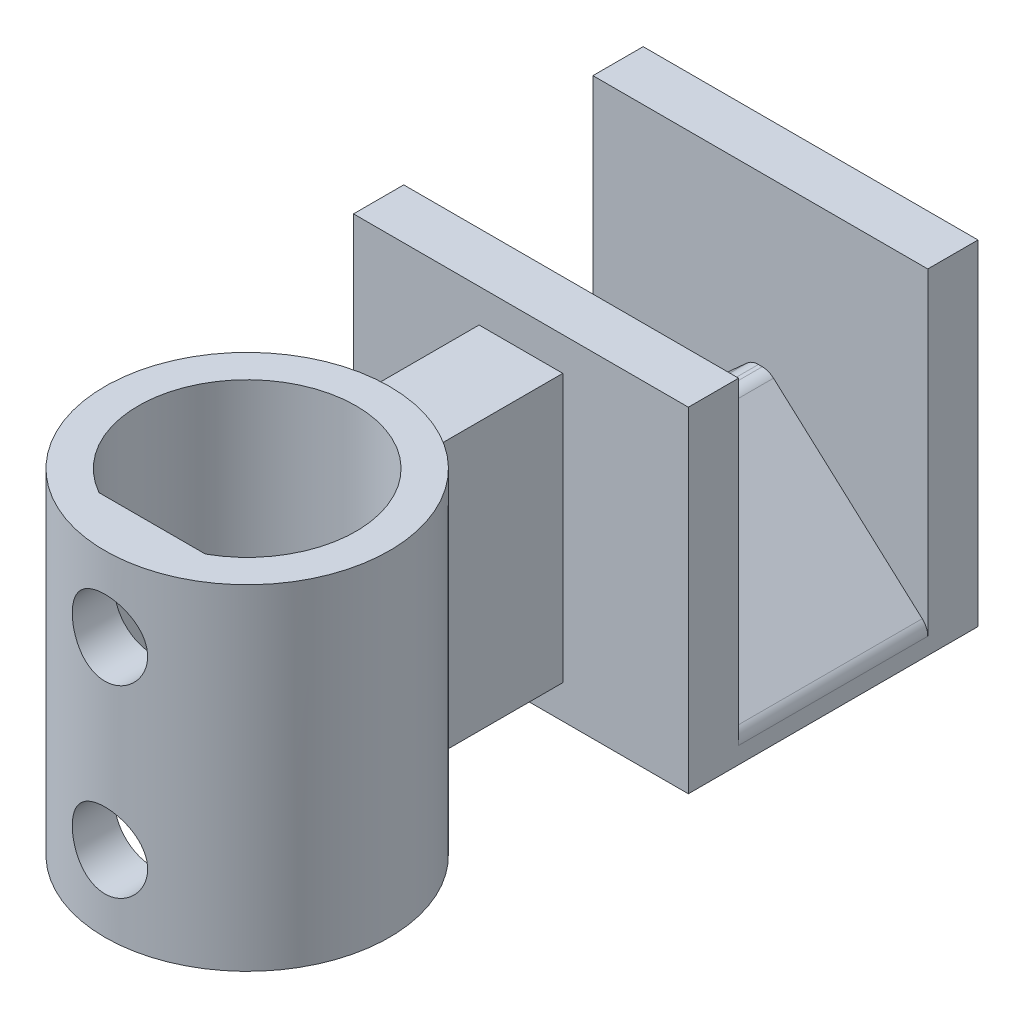
ISO-10303-21;
HEADER;
FILE_DESCRIPTION(('STEP AP214'),'2;1');
FILE_NAME('part.step','',(''),(''),'','','');
FILE_SCHEMA(('AUTOMOTIVE_DESIGN { 1 0 10303 214 1 1 1 1 }'));
ENDSEC;
DATA;
#1=APPLICATION_CONTEXT('core data for automotive mechanical design processes');
#2=APPLICATION_PROTOCOL_DEFINITION('international standard','automotive_design',2000,#1);
#3=PRODUCT_CONTEXT('',#1,'mechanical');
#4=PRODUCT('Part','Part','',(#3));
#5=PRODUCT_RELATED_PRODUCT_CATEGORY('part','',(#4));
#6=PRODUCT_DEFINITION_FORMATION('','',#4);
#7=PRODUCT_DEFINITION_CONTEXT('part definition',#1,'design');
#8=PRODUCT_DEFINITION('design','',#6,#7);
#9=PRODUCT_DEFINITION_SHAPE('','',#8);
#10=(LENGTH_UNIT() NAMED_UNIT(*) SI_UNIT(.MILLI.,.METRE.));
#11=(NAMED_UNIT(*) PLANE_ANGLE_UNIT() SI_UNIT($,.RADIAN.));
#12=(NAMED_UNIT(*) SI_UNIT($,.STERADIAN.) SOLID_ANGLE_UNIT());
#13=UNCERTAINTY_MEASURE_WITH_UNIT(LENGTH_MEASURE(1.E-05),#10,'distance_accuracy_value','');
#14=(GEOMETRIC_REPRESENTATION_CONTEXT(3) GLOBAL_UNCERTAINTY_ASSIGNED_CONTEXT((#13)) GLOBAL_UNIT_ASSIGNED_CONTEXT((#10,
#11,#12)) REPRESENTATION_CONTEXT('',''));
#15=CARTESIAN_POINT('',(0.,0.,0.));
#16=DIRECTION('',(0.,0.,1.));
#17=DIRECTION('',(1.,0.,0.));
#18=AXIS2_PLACEMENT_3D('',#15,#16,#17);
#19=CARTESIAN_POINT('',(0.,39.0416305603426,25.));
#20=DIRECTION('',(0.,-1.,0.));
#21=DIRECTION('',(0.,0.,-1.));
#22=AXIS2_PLACEMENT_3D('',#19,#20,#21);
#23=CYLINDRICAL_SURFACE('',#22,8.5);
#24=CARTESIAN_POINT('',(0.,15.,25.));
#25=DIRECTION('',(0.,-1.,0.));
#26=DIRECTION('',(0.,0.,-1.));
#27=AXIS2_PLACEMENT_3D('',#24,#25,#26);
#28=CIRCLE('',#27,8.5);
#29=CARTESIAN_POINT('',(0.,15.,16.5));
#30=VERTEX_POINT('',#29);
#31=EDGE_CURVE('E186',#30,#30,#28,.T.);
#32=ORIENTED_EDGE('',*,*,#31,.T.);
#33=EDGE_LOOP('',(#32));
#34=FACE_BOUND('',#33,.T.);
#35=CARTESIAN_POINT('',(0.,-5.,25.));
#36=DIRECTION('',(0.,1.,0.));
#37=DIRECTION('',(0.,0.,1.));
#38=AXIS2_PLACEMENT_3D('',#35,#36,#37);
#39=CIRCLE('',#38,8.5);
#40=CARTESIAN_POINT('',(0.,-5.,33.5));
#41=VERTEX_POINT('',#40);
#42=EDGE_CURVE('E192',#41,#41,#39,.F.);
#43=ORIENTED_EDGE('',*,*,#42,.F.);
#44=EDGE_LOOP('',(#43));
#45=FACE_BOUND('',#44,.T.);
#46=CARTESIAN_POINT('',(0.,-3.,25.));
#47=DIRECTION('',(0.,1.,0.));
#48=DIRECTION('',(0.,0.,1.));
#49=AXIS2_PLACEMENT_3D('',#46,#47,#48);
#50=CIRCLE('',#49,8.5);
#51=CARTESIAN_POINT('',(-2.5,-3.,16.875961595364));
#52=VERTEX_POINT('',#51);
#53=CARTESIAN_POINT('',(2.5,-3.,16.875961595364));
#54=VERTEX_POINT('',#53);
#55=EDGE_CURVE('E226',#52,#54,#50,.F.);
#56=ORIENTED_EDGE('',*,*,#55,.T.);
#57=DIRECTION('',(0.,-1.,0.));
#58=VECTOR('',#57,1.);
#59=CARTESIAN_POINT('',(2.5,39.0416305603426,16.875961595364));
#60=LINE('',#59,#58);
#61=CARTESIAN_POINT('',(2.5,13.,16.875961595364));
#62=VERTEX_POINT('',#61);
#63=EDGE_CURVE('E211',#54,#62,#60,.F.);
#64=ORIENTED_EDGE('',*,*,#63,.T.);
#65=CARTESIAN_POINT('',(0.,13.,25.));
#66=DIRECTION('',(0.,-1.,0.));
#67=DIRECTION('',(0.,0.,-1.));
#68=AXIS2_PLACEMENT_3D('',#65,#66,#67);
#69=CIRCLE('',#68,8.5);
#70=CARTESIAN_POINT('',(-2.5,13.,16.875961595364));
#71=VERTEX_POINT('',#70);
#72=EDGE_CURVE('E233',#62,#71,#69,.F.);
#73=ORIENTED_EDGE('',*,*,#72,.T.);
#74=DIRECTION('',(0.,-1.,0.));
#75=VECTOR('',#74,1.);
#76=CARTESIAN_POINT('',(-2.5,39.0416305603426,16.875961595364));
#77=LINE('',#76,#75);
#78=EDGE_CURVE('E230',#71,#52,#77,.T.);
#79=ORIENTED_EDGE('',*,*,#78,.T.);
#80=EDGE_LOOP('',(#56,#64,#73,#79));
#81=FACE_BOUND('',#80,.T.);
#82=CARTESIAN_POINT('',(-2.25,10.5,33.1967981553775));
#83=CARTESIAN_POINT('',(-2.24999694180408,10.6239840002776,33.1968003362435));
#84=CARTESIAN_POINT('',(-2.23971706610501,10.7480005412109,33.1996419584915));
#85=CARTESIAN_POINT('',(-2.198945615888,10.9924544608563,33.2106680196964));
#86=CARTESIAN_POINT('',(-2.16844370713168,11.112889976629,33.2188551904021));
#87=CARTESIAN_POINT('',(-2.0882990785985,11.3466102401079,33.2395815791112));
#88=CARTESIAN_POINT('',(-2.03868300476042,11.459904688051,33.2521147362105));
#89=CARTESIAN_POINT('',(-1.92180166354043,11.6765786826062,33.2801132198881));
#90=CARTESIAN_POINT('',(-1.85453509902009,11.7799574997535,33.2955787619447));
#91=CARTESIAN_POINT('',(-1.70248951742595,11.9764139017784,33.3281265446091));
#92=CARTESIAN_POINT('',(-1.61735395744878,12.0692109081865,33.3452371126252));
#93=CARTESIAN_POINT('',(-1.4327540142738,12.2393902103004,33.3789023677977));
#94=CARTESIAN_POINT('',(-1.33328816547564,12.3167709274061,33.3954569978831));
#95=CARTESIAN_POINT('',(-1.12090838569079,12.4550884366435,33.4264608929721));
#96=CARTESIAN_POINT('',(-1.00780712819347,12.5157466883929,33.4408728427373));
#97=CARTESIAN_POINT('',(-0.772566710508234,12.6170815196129,33.4656427357432));
#98=CARTESIAN_POINT('',(-0.650429055025734,12.6577614172222,33.4760013521304));
#99=CARTESIAN_POINT('',(-0.403511110172187,12.7170778425828,33.4912971460741));
#100=CARTESIAN_POINT('',(-0.278852839843893,12.7361915561904,33.4963515042717));
#101=CARTESIAN_POINT('',(-0.0280034780646866,12.7533339423421,33.5008788349257));
#102=CARTESIAN_POINT('',(0.0981873570184365,12.7513660941808,33.5003527283806));
#103=CARTESIAN_POINT('',(0.34519977639906,12.7267381177659,33.4938644304373));
#104=CARTESIAN_POINT('',(0.466076857336715,12.7045934898765,33.4880376721779));
#105=CARTESIAN_POINT('',(0.702334013138001,12.6410728615727,33.4717623278363));
#106=CARTESIAN_POINT('',(0.817713776487286,12.5996957727456,33.4613134801802));
#107=CARTESIAN_POINT('',(1.04102215095086,12.4984870248307,33.4367663576623));
#108=CARTESIAN_POINT('',(1.14886634833951,12.4384779194592,33.4226332115479));
#109=CARTESIAN_POINT('',(1.3531303740591,12.301844580475,33.3922415251126));
#110=CARTESIAN_POINT('',(1.44954799839656,12.2252171495074,33.375982576028));
#111=CARTESIAN_POINT('',(1.63129857081783,12.0547825542084,33.342521924539));
#112=CARTESIAN_POINT('',(1.71620777876131,11.9605256731685,33.3253065822884));
#113=CARTESIAN_POINT('',(1.86911637013184,11.7589321307718,33.2923181202052));
#114=CARTESIAN_POINT('',(1.93711475347608,11.6515946964081,33.2765450857034));
#115=CARTESIAN_POINT('',(2.05458778503724,11.4259787352489,33.2481731019722));
#116=CARTESIAN_POINT('',(2.10394886477225,11.3076384369629,33.2355937612802));
#117=CARTESIAN_POINT('',(2.18193716023719,11.0639230764637,33.2152779792318));
#118=CARTESIAN_POINT('',(2.21056943128527,10.9385497375025,33.207540357145));
#119=CARTESIAN_POINT('',(2.24556016825425,10.6882860893502,33.1980351929453));
#120=CARTESIAN_POINT('',(2.25255005779307,10.5634903897575,33.1960984643835));
#121=CARTESIAN_POINT('',(2.24579596911986,10.3145136151024,33.1979517680045));
#122=CARTESIAN_POINT('',(2.23205416085442,10.19033247708,33.2017412008412));
#123=CARTESIAN_POINT('',(2.18478304951454,9.94853203437677,33.2144565867633));
#124=CARTESIAN_POINT('',(2.15163187005439,9.83083314067768,33.2232843058655));
#125=CARTESIAN_POINT('',(2.06690749717098,9.60266578735862,33.2449859622244));
#126=CARTESIAN_POINT('',(2.0153319242454,9.49219826384843,33.2578604220901));
#127=CARTESIAN_POINT('',(1.89393612864426,9.27898360406455,33.2865532711528));
#128=CARTESIAN_POINT('',(1.82374430356199,9.17645600255329,33.3024294781708));
#129=CARTESIAN_POINT('',(1.66757023068808,8.98440278488017,33.3352002454647));
#130=CARTESIAN_POINT('',(1.58158505971235,8.89487958119961,33.3520949938724));
#131=CARTESIAN_POINT('',(1.39334723217788,8.72876291555247,33.3855805923336));
#132=CARTESIAN_POINT('',(1.29070161878611,8.65260935870141,33.4021491503459));
#133=CARTESIAN_POINT('',(1.07371678547403,8.51861464758931,33.4326221761272));
#134=CARTESIAN_POINT('',(0.959378187911347,8.46077251937521,33.4465267855714));
#135=CARTESIAN_POINT('',(0.723057226149525,8.36557056201773,33.470015772103));
#136=CARTESIAN_POINT('',(0.60113959611423,8.32805833034544,33.4796321961789));
#137=CARTESIAN_POINT('',(0.352439036803731,8.2741367860407,33.4936022569498));
#138=CARTESIAN_POINT('',(0.225657174963255,8.25772287044393,33.4979570415506));
#139=CARTESIAN_POINT('',(-0.0250604722587875,8.24674873433714,33.5008598374346));
#140=CARTESIAN_POINT('',(-0.148966409472797,8.2515427679478,33.499579436696));
#141=CARTESIAN_POINT('',(-0.394141954180563,8.28135153536109,33.4917428575153));
#142=CARTESIAN_POINT('',(-0.515411657917084,8.30636552970252,33.4851868720061));
#143=CARTESIAN_POINT('',(-0.751107699159933,8.37554121781611,33.4675689262979));
#144=CARTESIAN_POINT('',(-0.865574416324465,8.41957360028427,33.4565374265752));
#145=CARTESIAN_POINT('',(-1.08556048681217,8.5254205314973,33.4311229382255));
#146=CARTESIAN_POINT('',(-1.19107859706731,8.58723754551755,33.4167394850088));
#147=CARTESIAN_POINT('',(-1.39318530515942,8.72879850578497,33.3856885458129));
#148=CARTESIAN_POINT('',(-1.48946543719377,8.80897181418192,33.3689708718519));
#149=CARTESIAN_POINT('',(-1.66742398064291,8.98415288335479,33.3353414220771));
#150=CARTESIAN_POINT('',(-1.74909856114583,9.07916452389294,33.3184295965731));
#151=CARTESIAN_POINT('',(-1.8972708258445,9.2837921479421,33.285906991571));
#152=CARTESIAN_POINT('',(-1.96340296292341,9.39367904330234,33.2703321637851));
#153=CARTESIAN_POINT('',(-2.07615948784757,9.62341015894324,33.2427515934587));
#154=CARTESIAN_POINT('',(-2.12279681152532,9.74324771294936,33.2307434857482));
#155=CARTESIAN_POINT('',(-2.18903256232817,9.96889360228065,33.2133487458215));
#156=CARTESIAN_POINT('',(-2.21184214669942,10.0737109686333,33.2071920574266));
#157=CARTESIAN_POINT('',(-2.24232635318084,10.2856776239988,33.1989160421293));
#158=CARTESIAN_POINT('',(-2.25000264354342,10.3928266546586,33.1967962702092));
#159=CARTESIAN_POINT('',(-2.25,10.5,33.1967981553775));
#160=B_SPLINE_CURVE_WITH_KNOTS('',3,(#82,#83,#84,#85,#86,#87,#88,#89,#90,#91,#92,#93,#94,#95,
#96,#97,#98,#99,#100,#101,#102,#103,#104,#105,#106,#107,#108,#109,#110,#111,#112,#113,#114,#115,
#116,#117,#118,#119,#120,#121,#122,#123,#124,#125,#126,#127,#128,#129,#130,#131,#132,#133,#134,
#135,#136,#137,#138,#139,#140,#141,#142,#143,#144,#145,#146,#147,#148,#149,#150,#151,#152,#153,
#154,#155,#156,#157,#158,#159),.UNSPECIFIED.,.T.,.F.,(4,2,2,2,2,2,2,2,2,2,2,2,2,2,2,2,2,2,2,2,2,
2,2,2,2,2,2,2,2,2,2,2,2,2,2,2,2,2,4),(0.,0.37155797163531,0.743305970231715,1.11453760110695,
1.48579652152091,1.86532086241599,2.24488404596034,2.63043245150024,3.01591680090743,
3.39269333716487,3.76940769129443,4.13675920765004,4.50413151587257,4.87511584526133,
5.24617161521628,5.62845622010334,6.01076342740043,6.3953640456007,6.77987083621654,
7.15304843134813,7.52618696941451,7.89228731518204,8.25843495975225,8.63252754907452,
9.00668944894658,9.39148781847044,9.77626571779774,10.1581177737158,10.539886507824,
10.9101123860205,11.2803247253535,11.6480585642679,12.0158434024024,12.3933170752266,
12.7708896114263,13.156610044578,13.5420741241071,13.8632889681006,14.1844684002793),.UNSPECIFIED.);
#161=CARTESIAN_POINT('',(-2.25,10.5,33.1967981553775));
#162=VERTEX_POINT('',#161);
#163=EDGE_CURVE('E198',#162,#162,#160,.T.);
#164=ORIENTED_EDGE('',*,*,#163,.T.);
#165=EDGE_LOOP('',(#164));
#166=FACE_BOUND('',#165,.T.);
#167=CARTESIAN_POINT('',(-2.25,-0.500000000000002,33.1967981553775));
#168=CARTESIAN_POINT('',(-2.24999694180408,-0.376015999722374,33.1968003362435));
#169=CARTESIAN_POINT('',(-2.23971706610501,-0.251999458789078,33.1996419584915));
#170=CARTESIAN_POINT('',(-2.198945615888,-0.00754553914369019,33.2106680196964));
#171=CARTESIAN_POINT('',(-2.16844370713168,0.112889976628972,33.2188551904021));
#172=CARTESIAN_POINT('',(-2.0882990785985,0.346610240107896,33.2395815791112));
#173=CARTESIAN_POINT('',(-2.03868300476042,0.459904688051024,33.2521147362105));
#174=CARTESIAN_POINT('',(-1.92180166354043,0.676578682606188,33.2801132198881));
#175=CARTESIAN_POINT('',(-1.85453509902009,0.779957499753548,33.2955787619447));
#176=CARTESIAN_POINT('',(-1.70248951742595,0.976413901778359,33.3281265446091));
#177=CARTESIAN_POINT('',(-1.61735395744878,1.06921090818649,33.3452371126252));
#178=CARTESIAN_POINT('',(-1.4327540142738,1.23939021030035,33.3789023677977));
#179=CARTESIAN_POINT('',(-1.33328816547564,1.31677092740614,33.3954569978831));
#180=CARTESIAN_POINT('',(-1.12090838569079,1.45508843664353,33.426460892972));
#181=CARTESIAN_POINT('',(-1.00780712819347,1.51574668839292,33.4408728427372));
#182=CARTESIAN_POINT('',(-0.772566710508234,1.6170815196129,33.4656427357431));
#183=CARTESIAN_POINT('',(-0.650429055025735,1.65776141722221,33.4760013521304));
#184=CARTESIAN_POINT('',(-0.403511110172187,1.71707784258281,33.4912971460741));
#185=CARTESIAN_POINT('',(-0.278852839843893,1.73619155619042,33.4963515042717));
#186=CARTESIAN_POINT('',(-0.0280034780646869,1.75333394234214,33.5008788349257));
#187=CARTESIAN_POINT('',(0.0981873570184361,1.75136609418084,33.5003527283806));
#188=CARTESIAN_POINT('',(0.34519977639906,1.72673811776592,33.4938644304373));
#189=CARTESIAN_POINT('',(0.466076857336715,1.70459348987647,33.4880376721779));
#190=CARTESIAN_POINT('',(0.702334013138001,1.6410728615727,33.4717623278363));
#191=CARTESIAN_POINT('',(0.817713776487285,1.59969577274563,33.4613134801802));
#192=CARTESIAN_POINT('',(1.04102215095086,1.49848702483075,33.4367663576623));
#193=CARTESIAN_POINT('',(1.14886634833951,1.43847791945919,33.4226332115479));
#194=CARTESIAN_POINT('',(1.3531303740591,1.30184458047502,33.3922415251126));
#195=CARTESIAN_POINT('',(1.44954799839656,1.22521714950741,33.375982576028));
#196=CARTESIAN_POINT('',(1.63129857081783,1.05478255420836,33.342521924539));
#197=CARTESIAN_POINT('',(1.71620777876131,0.960525673168511,33.3253065822884));
#198=CARTESIAN_POINT('',(1.86911637013183,0.758932130771777,33.2923181202052));
#199=CARTESIAN_POINT('',(1.93711475347608,0.651594696408099,33.2765450857034));
#200=CARTESIAN_POINT('',(2.05458778503724,0.425978735248875,33.2481731019722));
#201=CARTESIAN_POINT('',(2.10394886477225,0.307638436962872,33.2355937612802));
#202=CARTESIAN_POINT('',(2.18193716023719,0.0639230764637289,33.2152779792318));
#203=CARTESIAN_POINT('',(2.21056943128527,-0.0614502624975041,33.207540357145));
#204=CARTESIAN_POINT('',(2.24556016825425,-0.311713910649751,33.1980351929453));
#205=CARTESIAN_POINT('',(2.25255005779307,-0.436509610242537,33.1960984643835));
#206=CARTESIAN_POINT('',(2.24579596911986,-0.685486384897617,33.1979517680045));
#207=CARTESIAN_POINT('',(2.23205416085442,-0.809667522920008,33.2017412008412));
#208=CARTESIAN_POINT('',(2.18478304951454,-1.05146796562323,33.2144565867633));
#209=CARTESIAN_POINT('',(2.15163187005439,-1.16916685932232,33.2232843058654));
#210=CARTESIAN_POINT('',(2.06690749717098,-1.39733421264138,33.2449859622244));
#211=CARTESIAN_POINT('',(2.0153319242454,-1.50780173615157,33.2578604220901));
#212=CARTESIAN_POINT('',(1.89393612864426,-1.72101639593545,33.2865532711528));
#213=CARTESIAN_POINT('',(1.82374430356199,-1.82354399744671,33.3024294781708));
#214=CARTESIAN_POINT('',(1.66757023068808,-2.01559721511983,33.3352002454647));
#215=CARTESIAN_POINT('',(1.58158505971235,-2.10512041880039,33.3520949938724));
#216=CARTESIAN_POINT('',(1.39334723217788,-2.27123708444753,33.3855805923336));
#217=CARTESIAN_POINT('',(1.29070161878611,-2.34739064129859,33.4021491503459));
#218=CARTESIAN_POINT('',(1.07371678547403,-2.48138535241069,33.4326221761272));
#219=CARTESIAN_POINT('',(0.959378187911347,-2.53922748062479,33.4465267855714));
#220=CARTESIAN_POINT('',(0.723057226149525,-2.63442943798227,33.470015772103));
#221=CARTESIAN_POINT('',(0.60113959611423,-2.67194166965456,33.4796321961789));
#222=CARTESIAN_POINT('',(0.352439036803731,-2.7258632139593,33.4936022569498));
#223=CARTESIAN_POINT('',(0.225657174963256,-2.74227712955607,33.4979570415506));
#224=CARTESIAN_POINT('',(-0.0250604722587871,-2.75325126566286,33.5008598374346));
#225=CARTESIAN_POINT('',(-0.148966409472797,-2.7484572320522,33.499579436696));
#226=CARTESIAN_POINT('',(-0.394141954180563,-2.71864846463891,33.4917428575153));
#227=CARTESIAN_POINT('',(-0.515411657917083,-2.69363447029748,33.4851868720061));
#228=CARTESIAN_POINT('',(-0.751107699159933,-2.62445878218389,33.4675689262979));
#229=CARTESIAN_POINT('',(-0.865574416324465,-2.58042639971573,33.4565374265752));
#230=CARTESIAN_POINT('',(-1.08556048681217,-2.4745794685027,33.4311229382255));
#231=CARTESIAN_POINT('',(-1.19107859706731,-2.41276245448245,33.4167394850088));
#232=CARTESIAN_POINT('',(-1.39318530515942,-2.27120149421503,33.3856885458129));
#233=CARTESIAN_POINT('',(-1.48946543719377,-2.19102818581808,33.3689708718519));
#234=CARTESIAN_POINT('',(-1.66742398064291,-2.01584711664521,33.3353414220771));
#235=CARTESIAN_POINT('',(-1.74909856114582,-1.92083547610706,33.3184295965731));
#236=CARTESIAN_POINT('',(-1.8972708258445,-1.7162078520579,33.285906991571));
#237=CARTESIAN_POINT('',(-1.96340296292341,-1.60632095669767,33.2703321637851));
#238=CARTESIAN_POINT('',(-2.07615948784757,-1.37658984105676,33.2427515934587));
#239=CARTESIAN_POINT('',(-2.12279681152532,-1.25675228705065,33.2307434857482));
#240=CARTESIAN_POINT('',(-2.18903256232817,-1.03110639771935,33.2133487458215));
#241=CARTESIAN_POINT('',(-2.21184214669942,-0.92628903136672,33.2071920574266));
#242=CARTESIAN_POINT('',(-2.24232635318084,-0.714322376001232,33.1989160421293));
#243=CARTESIAN_POINT('',(-2.25000264354342,-0.607173345341352,33.1967962702092));
#244=CARTESIAN_POINT('',(-2.25,-0.500000000000002,33.1967981553775));
#245=B_SPLINE_CURVE_WITH_KNOTS('',3,(#167,#168,#169,#170,#171,#172,#173,#174,#175,#176,#177,
#178,#179,#180,#181,#182,#183,#184,#185,#186,#187,#188,#189,#190,#191,#192,#193,#194,#195,#196,
#197,#198,#199,#200,#201,#202,#203,#204,#205,#206,#207,#208,#209,#210,#211,#212,#213,#214,#215,
#216,#217,#218,#219,#220,#221,#222,#223,#224,#225,#226,#227,#228,#229,#230,#231,#232,#233,#234,
#235,#236,#237,#238,#239,#240,#241,#242,#243,#244),.UNSPECIFIED.,.T.,.F.,(4,2,2,2,2,2,2,2,2,2,2,
2,2,2,2,2,2,2,2,2,2,2,2,2,2,2,2,2,2,2,2,2,2,2,2,2,2,2,4),(0.,0.371557971635309,
0.743305970231715,1.11453760110695,1.48579652152091,1.86532086241599,2.24488404596033,
2.63043245150024,3.01591680090743,3.39269333716487,3.76940769129443,4.13675920765004,
4.50413151587256,4.87511584526133,5.24617161521628,5.62845622010334,6.01076342740043,
6.3953640456007,6.77987083621654,7.15304843134812,7.5261869694145,7.89228731518204,
8.25843495975225,8.63252754907452,9.00668944894658,9.39148781847044,9.77626571779773,
10.1581177737158,10.539886507824,10.9101123860205,11.2803247253535,11.6480585642679,
12.0158434024024,12.3933170752266,12.7708896114263,13.156610044578,13.5420741241071,
13.8632889681006,14.1844684002793),.UNSPECIFIED.);
#246=CARTESIAN_POINT('',(-2.25,-0.500000000000002,33.1967981553775));
#247=VERTEX_POINT('',#246);
#248=EDGE_CURVE('E616',#247,#247,#245,.T.);
#249=ORIENTED_EDGE('',*,*,#248,.T.);
#250=EDGE_LOOP('',(#249));
#251=FACE_BOUND('',#250,.T.);
#252=ADVANCED_FACE('F35',(#34,#45,#81,#166,#251),#23,.T.);
#253=CARTESIAN_POINT('',(0.,0.,8.65));
#254=DIRECTION('',(0.,0.,1.));
#255=DIRECTION('',(1.,0.,0.));
#256=AXIS2_PLACEMENT_3D('',#253,#254,#255);
#257=PLANE('',#256);
#258=DIRECTION('',(0.,1.,0.));
#259=VECTOR('',#258,1.);
#260=CARTESIAN_POINT('',(10.,15.,8.65));
#261=LINE('',#260,#259);
#262=CARTESIAN_POINT('',(10.,-5.,8.65));
#263=VERTEX_POINT('',#262);
#264=CARTESIAN_POINT('',(10.,15.,8.65));
#265=VERTEX_POINT('',#264);
#266=EDGE_CURVE('E263',#263,#265,#261,.T.);
#267=ORIENTED_EDGE('',*,*,#266,.T.);
#268=DIRECTION('',(-1.,0.,0.));
#269=VECTOR('',#268,1.);
#270=CARTESIAN_POINT('',(-10.,15.,8.65));
#271=LINE('',#270,#269);
#272=CARTESIAN_POINT('',(-10.,15.,8.65));
#273=VERTEX_POINT('',#272);
#274=EDGE_CURVE('E266',#265,#273,#271,.T.);
#275=ORIENTED_EDGE('',*,*,#274,.T.);
#276=DIRECTION('',(0.,-1.,0.));
#277=VECTOR('',#276,1.);
#278=CARTESIAN_POINT('',(-10.,15.,8.65));
#279=LINE('',#278,#277);
#280=CARTESIAN_POINT('',(-10.,-5.,8.65));
#281=VERTEX_POINT('',#280);
#282=EDGE_CURVE('E269',#273,#281,#279,.T.);
#283=ORIENTED_EDGE('',*,*,#282,.T.);
#284=DIRECTION('',(1.,0.,0.));
#285=VECTOR('',#284,1.);
#286=CARTESIAN_POINT('',(-10.,-5.,8.65));
#287=LINE('',#286,#285);
#288=EDGE_CURVE('E272',#281,#263,#287,.T.);
#289=ORIENTED_EDGE('',*,*,#288,.T.);
#290=EDGE_LOOP('',(#267,#275,#283,#289));
#291=FACE_BOUND('',#290,.T.);
#292=DIRECTION('',(-1.,0.,0.));
#293=VECTOR('',#292,1.);
#294=CARTESIAN_POINT('',(-2.5,13.,8.65));
#295=LINE('',#294,#293);
#296=CARTESIAN_POINT('',(2.5,13.,8.65));
#297=VERTEX_POINT('',#296);
#298=CARTESIAN_POINT('',(-2.5,13.,8.65));
#299=VERTEX_POINT('',#298);
#300=EDGE_CURVE('E215',#297,#299,#295,.T.);
#301=ORIENTED_EDGE('',*,*,#300,.F.);
#302=DIRECTION('',(0.,1.,0.));
#303=VECTOR('',#302,1.);
#304=CARTESIAN_POINT('',(2.5,13.,8.65));
#305=LINE('',#304,#303);
#306=CARTESIAN_POINT('',(2.5,-3.,8.65));
#307=VERTEX_POINT('',#306);
#308=EDGE_CURVE('E219',#307,#297,#305,.T.);
#309=ORIENTED_EDGE('',*,*,#308,.F.);
#310=DIRECTION('',(1.,0.,0.));
#311=VECTOR('',#310,1.);
#312=CARTESIAN_POINT('',(-2.5,-3.,8.65));
#313=LINE('',#312,#311);
#314=CARTESIAN_POINT('',(-2.5,-3.,8.65));
#315=VERTEX_POINT('',#314);
#316=EDGE_CURVE('E208',#315,#307,#313,.T.);
#317=ORIENTED_EDGE('',*,*,#316,.F.);
#318=DIRECTION('',(0.,-1.,0.));
#319=VECTOR('',#318,1.);
#320=CARTESIAN_POINT('',(-2.5,13.,8.65));
#321=LINE('',#320,#319);
#322=EDGE_CURVE('E52',#299,#315,#321,.T.);
#323=ORIENTED_EDGE('',*,*,#322,.F.);
#324=EDGE_LOOP('',(#301,#309,#317,#323));
#325=FACE_BOUND('',#324,.T.);
#326=ADVANCED_FACE('F396',(#291,#325),#257,.T.);
#327=CARTESIAN_POINT('',(10.,-5.,5.65));
#328=DIRECTION('',(-1.,0.,0.));
#329=DIRECTION('',(0.,0.,1.));
#330=AXIS2_PLACEMENT_3D('',#327,#328,#329);
#331=PLANE('',#330);
#332=DIRECTION('',(0.,0.,-1.));
#333=VECTOR('',#332,1.);
#334=CARTESIAN_POINT('',(10.,-5.,5.65));
#335=LINE('',#334,#333);
#336=CARTESIAN_POINT('',(10.,-5.,-8.65));
#337=VERTEX_POINT('',#336);
#338=EDGE_CURVE('E290',#263,#337,#335,.T.);
#339=ORIENTED_EDGE('',*,*,#338,.T.);
#340=DIRECTION('',(0.,1.,0.));
#341=VECTOR('',#340,1.);
#342=CARTESIAN_POINT('',(10.,15.,-8.65));
#343=LINE('',#342,#341);
#344=CARTESIAN_POINT('',(10.,15.,-8.65));
#345=VERTEX_POINT('',#344);
#346=EDGE_CURVE('E238',#337,#345,#343,.T.);
#347=ORIENTED_EDGE('',*,*,#346,.T.);
#348=DIRECTION('',(0.,0.,1.));
#349=VECTOR('',#348,1.);
#350=CARTESIAN_POINT('',(10.,15.,-8.65));
#351=LINE('',#350,#349);
#352=CARTESIAN_POINT('',(10.,15.,-5.65));
#353=VERTEX_POINT('',#352);
#354=EDGE_CURVE('E251',#345,#353,#351,.T.);
#355=ORIENTED_EDGE('',*,*,#354,.T.);
#356=DIRECTION('',(0.,1.,0.));
#357=VECTOR('',#356,1.);
#358=CARTESIAN_POINT('',(10.,15.,-5.65));
#359=LINE('',#358,#357);
#360=CARTESIAN_POINT('',(10.,-3.99906710613801,-5.65));
#361=VERTEX_POINT('',#360);
#362=EDGE_CURVE('E229',#361,#353,#359,.T.);
#363=ORIENTED_EDGE('',*,*,#362,.F.);
#364=DIRECTION('',(0.,0.,-1.));
#365=VECTOR('',#364,1.);
#366=CARTESIAN_POINT('',(10.,-3.99906710613801,5.65));
#367=LINE('',#366,#365);
#368=CARTESIAN_POINT('',(10.,-3.99906710613801,5.65));
#369=VERTEX_POINT('',#368);
#370=EDGE_CURVE('E336',#361,#369,#367,.F.);
#371=ORIENTED_EDGE('',*,*,#370,.T.);
#372=DIRECTION('',(0.,1.,0.));
#373=VECTOR('',#372,1.);
#374=CARTESIAN_POINT('',(10.,15.,5.65));
#375=LINE('',#374,#373);
#376=CARTESIAN_POINT('',(10.,15.,5.65));
#377=VERTEX_POINT('',#376);
#378=EDGE_CURVE('E262',#369,#377,#375,.T.);
#379=ORIENTED_EDGE('',*,*,#378,.T.);
#380=DIRECTION('',(0.,0.,-1.));
#381=VECTOR('',#380,1.);
#382=CARTESIAN_POINT('',(10.,15.,8.65));
#383=LINE('',#382,#381);
#384=EDGE_CURVE('E283',#265,#377,#383,.T.);
#385=ORIENTED_EDGE('',*,*,#384,.F.);
#386=ORIENTED_EDGE('',*,*,#266,.F.);
#387=EDGE_LOOP('',(#339,#347,#355,#363,#371,#379,#385,#386));
#388=FACE_BOUND('',#387,.T.);
#389=ADVANCED_FACE('F374',(#388),#331,.F.);
#390=CARTESIAN_POINT('',(-10.,5.,5.65));
#391=DIRECTION('',(0.,-1.,0.));
#392=DIRECTION('',(0.,0.,-1.));
#393=AXIS2_PLACEMENT_3D('',#390,#391,#392);
#394=PLANE('',#393);
#395=DIRECTION('',(-1.,0.,0.));
#396=VECTOR('',#395,1.);
#397=CARTESIAN_POINT('',(-10.,5.,5.65));
#398=LINE('',#397,#396);
#399=CARTESIAN_POINT('',(0.116135964964554,5.,5.65));
#400=VERTEX_POINT('',#399);
#401=CARTESIAN_POINT('',(-0.116135964964547,5.,5.65));
#402=VERTEX_POINT('',#401);
#403=EDGE_CURVE('E287',#400,#402,#398,.T.);
#404=ORIENTED_EDGE('',*,*,#403,.F.);
#405=DIRECTION('',(0.,0.,1.));
#406=VECTOR('',#405,1.);
#407=CARTESIAN_POINT('',(0.116135964964554,5.,-5.65));
#408=LINE('',#407,#406);
#409=CARTESIAN_POINT('',(0.116135964964554,5.,-5.65));
#410=VERTEX_POINT('',#409);
#411=EDGE_CURVE('E11',#400,#410,#408,.F.);
#412=ORIENTED_EDGE('',*,*,#411,.T.);
#413=DIRECTION('',(-1.,0.,0.));
#414=VECTOR('',#413,1.);
#415=CARTESIAN_POINT('',(-10.,5.,-5.65));
#416=LINE('',#415,#414);
#417=CARTESIAN_POINT('',(-0.116135964964547,5.,-5.65));
#418=VERTEX_POINT('',#417);
#419=EDGE_CURVE('E286',#410,#418,#416,.T.);
#420=ORIENTED_EDGE('',*,*,#419,.T.);
#421=DIRECTION('',(0.,0.,-1.));
#422=VECTOR('',#421,1.);
#423=CARTESIAN_POINT('',(-0.116135964964547,5.,5.65));
#424=LINE('',#423,#422);
#425=EDGE_CURVE('E44',#418,#402,#424,.F.);
#426=ORIENTED_EDGE('',*,*,#425,.T.);
#427=EDGE_LOOP('',(#404,#412,#420,#426));
#428=FACE_BOUND('',#427,.T.);
#429=ADVANCED_FACE('F344',(#428),#394,.F.);
#430=CARTESIAN_POINT('',(-10.,-5.,5.65));
#431=DIRECTION('',(1.,0.,0.));
#432=DIRECTION('',(0.,0.,-1.));
#433=AXIS2_PLACEMENT_3D('',#430,#431,#432);
#434=PLANE('',#433);
#435=DIRECTION('',(0.,0.,-1.));
#436=VECTOR('',#435,1.);
#437=CARTESIAN_POINT('',(-10.,-5.,5.65));
#438=LINE('',#437,#436);
#439=CARTESIAN_POINT('',(-10.,-5.,-8.65));
#440=VERTEX_POINT('',#439);
#441=EDGE_CURVE('E293',#281,#440,#438,.T.);
#442=ORIENTED_EDGE('',*,*,#441,.F.);
#443=ORIENTED_EDGE('',*,*,#282,.F.);
#444=DIRECTION('',(0.,0.,-1.));
#445=VECTOR('',#444,1.);
#446=CARTESIAN_POINT('',(-10.,15.,8.65));
#447=LINE('',#446,#445);
#448=CARTESIAN_POINT('',(-10.,15.,5.65));
#449=VERTEX_POINT('',#448);
#450=EDGE_CURVE('E275',#273,#449,#447,.T.);
#451=ORIENTED_EDGE('',*,*,#450,.T.);
#452=DIRECTION('',(0.,-1.,0.));
#453=VECTOR('',#452,1.);
#454=CARTESIAN_POINT('',(-10.,15.,5.65));
#455=LINE('',#454,#453);
#456=CARTESIAN_POINT('',(-10.,-3.99906710613801,5.65));
#457=VERTEX_POINT('',#456);
#458=EDGE_CURVE('E267',#449,#457,#455,.T.);
#459=ORIENTED_EDGE('',*,*,#458,.T.);
#460=DIRECTION('',(0.,0.,1.));
#461=VECTOR('',#460,1.);
#462=CARTESIAN_POINT('',(-10.,-3.99906710613801,-5.65));
#463=LINE('',#462,#461);
#464=CARTESIAN_POINT('',(-10.,-3.99906710613801,-5.65));
#465=VERTEX_POINT('',#464);
#466=EDGE_CURVE('E307',#457,#465,#463,.F.);
#467=ORIENTED_EDGE('',*,*,#466,.T.);
#468=DIRECTION('',(0.,-1.,0.));
#469=VECTOR('',#468,1.);
#470=CARTESIAN_POINT('',(-10.,15.,-5.65));
#471=LINE('',#470,#469);
#472=CARTESIAN_POINT('',(-10.,15.,-5.65));
#473=VERTEX_POINT('',#472);
#474=EDGE_CURVE('E253',#473,#465,#471,.T.);
#475=ORIENTED_EDGE('',*,*,#474,.F.);
#476=DIRECTION('',(0.,0.,1.));
#477=VECTOR('',#476,1.);
#478=CARTESIAN_POINT('',(-10.,15.,-8.65));
#479=LINE('',#478,#477);
#480=CARTESIAN_POINT('',(-10.,15.,-8.65));
#481=VERTEX_POINT('',#480);
#482=EDGE_CURVE('E260',#481,#473,#479,.T.);
#483=ORIENTED_EDGE('',*,*,#482,.F.);
#484=DIRECTION('',(0.,-1.,0.));
#485=VECTOR('',#484,1.);
#486=CARTESIAN_POINT('',(-10.,15.,-8.65));
#487=LINE('',#486,#485);
#488=EDGE_CURVE('E245',#481,#440,#487,.T.);
#489=ORIENTED_EDGE('',*,*,#488,.T.);
#490=EDGE_LOOP('',(#442,#443,#451,#459,#467,#475,#483,#489));
#491=FACE_BOUND('',#490,.T.);
#492=ADVANCED_FACE('F365',(#491),#434,.F.);
#493=CARTESIAN_POINT('',(-10.,-5.,5.65));
#494=DIRECTION('',(0.,1.,0.));
#495=DIRECTION('',(0.,0.,1.));
#496=AXIS2_PLACEMENT_3D('',#493,#494,#495);
#497=PLANE('',#496);
#498=ORIENTED_EDGE('',*,*,#441,.T.);
#499=DIRECTION('',(1.,0.,0.));
#500=VECTOR('',#499,1.);
#501=CARTESIAN_POINT('',(-10.,-5.,-8.65));
#502=LINE('',#501,#500);
#503=EDGE_CURVE('E241',#440,#337,#502,.T.);
#504=ORIENTED_EDGE('',*,*,#503,.T.);
#505=ORIENTED_EDGE('',*,*,#338,.F.);
#506=ORIENTED_EDGE('',*,*,#288,.F.);
#507=EDGE_LOOP('',(#498,#504,#505,#506));
#508=FACE_BOUND('',#507,.T.);
#509=ADVANCED_FACE('F384',(#508),#497,.F.);
#510=CARTESIAN_POINT('',(0.499999999999967,5.,5.65));
#511=DIRECTION('',(-0.669130606358857,-0.743144825477396,0.));
#512=DIRECTION('',(0.,0.,-1.));
#513=AXIS2_PLACEMENT_3D('',#510,#511,#512);
#514=PLANE('',#513);
#515=DIRECTION('',(0.743144825477396,-0.669130606358857,0.));
#516=VECTOR('',#515,1.);
#517=CARTESIAN_POINT('',(0.499999999999967,5.,5.65));
#518=LINE('',#517,#516);
#519=CARTESIAN_POINT('',(9.66913060635886,-3.25592228066062,5.65));
#520=VERTEX_POINT('',#519);
#521=CARTESIAN_POINT('',(0.78526657132341,4.7431448254774,5.65));
#522=VERTEX_POINT('',#521);
#523=EDGE_CURVE('E304',#520,#522,#518,.F.);
#524=ORIENTED_EDGE('',*,*,#523,.F.);
#525=DIRECTION('',(0.,0.,1.));
#526=VECTOR('',#525,1.);
#527=CARTESIAN_POINT('',(9.66913060635886,-3.25592228066062,-5.65));
#528=LINE('',#527,#526);
#529=CARTESIAN_POINT('',(9.66913060635886,-3.25592228066062,-5.65));
#530=VERTEX_POINT('',#529);
#531=EDGE_CURVE('E341',#520,#530,#528,.F.);
#532=ORIENTED_EDGE('',*,*,#531,.T.);
#533=DIRECTION('',(-0.743144825477396,0.669130606358857,0.));
#534=VECTOR('',#533,1.);
#535=CARTESIAN_POINT('',(2.71017262260375,3.0099516320112,-5.65));
#536=LINE('',#535,#534);
#537=CARTESIAN_POINT('',(0.785266571323411,4.7431448254774,-5.65));
#538=VERTEX_POINT('',#537);
#539=EDGE_CURVE('E298',#538,#530,#536,.F.);
#540=ORIENTED_EDGE('',*,*,#539,.F.);
#541=DIRECTION('',(0.,0.,-1.));
#542=VECTOR('',#541,1.);
#543=CARTESIAN_POINT('',(0.78526657132341,4.7431448254774,5.65));
#544=LINE('',#543,#542);
#545=EDGE_CURVE('E339',#538,#522,#544,.F.);
#546=ORIENTED_EDGE('',*,*,#545,.T.);
#547=EDGE_LOOP('',(#524,#532,#540,#546));
#548=FACE_BOUND('',#547,.T.);
#549=ADVANCED_FACE('F382',(#548),#514,.F.);
#550=CARTESIAN_POINT('',(-10.,-3.55383842082948,5.65));
#551=DIRECTION('',(0.669130606358857,-0.743144825477396,0.));
#552=DIRECTION('',(0.,0.,-1.));
#553=AXIS2_PLACEMENT_3D('',#550,#551,#552);
#554=PLANE('',#553);
#555=DIRECTION('',(-0.743144825477396,-0.669130606358857,0.));
#556=VECTOR('',#555,1.);
#557=CARTESIAN_POINT('',(-2.71017262260375,3.00995163201119,-5.65));
#558=LINE('',#557,#556);
#559=CARTESIAN_POINT('',(-9.66913060635886,-3.25592228066062,-5.65));
#560=VERTEX_POINT('',#559);
#561=CARTESIAN_POINT('',(-0.785266571323403,4.74314482547739,-5.65));
#562=VERTEX_POINT('',#561);
#563=EDGE_CURVE('E295',#560,#562,#558,.F.);
#564=ORIENTED_EDGE('',*,*,#563,.F.);
#565=DIRECTION('',(0.,0.,-1.));
#566=VECTOR('',#565,1.);
#567=CARTESIAN_POINT('',(-9.66913060635885,-3.25592228066062,5.65));
#568=LINE('',#567,#566);
#569=CARTESIAN_POINT('',(-9.66913060635885,-3.25592228066062,5.65));
#570=VERTEX_POINT('',#569);
#571=EDGE_CURVE('E324',#560,#570,#568,.F.);
#572=ORIENTED_EDGE('',*,*,#571,.T.);
#573=DIRECTION('',(0.743144825477396,0.669130606358857,0.));
#574=VECTOR('',#573,1.);
#575=CARTESIAN_POINT('',(-10.,-3.55383842082948,5.65));
#576=LINE('',#575,#574);
#577=CARTESIAN_POINT('',(-0.785266571323401,4.7431448254774,5.65));
#578=VERTEX_POINT('',#577);
#579=EDGE_CURVE('E301',#578,#570,#576,.F.);
#580=ORIENTED_EDGE('',*,*,#579,.F.);
#581=DIRECTION('',(0.,0.,1.));
#582=VECTOR('',#581,1.);
#583=CARTESIAN_POINT('',(-0.785266571323403,4.74314482547739,-5.65));
#584=LINE('',#583,#582);
#585=EDGE_CURVE('E322',#578,#562,#584,.F.);
#586=ORIENTED_EDGE('',*,*,#585,.T.);
#587=EDGE_LOOP('',(#564,#572,#580,#586));
#588=FACE_BOUND('',#587,.T.);
#589=ADVANCED_FACE('F358',(#588),#554,.F.);
#590=CARTESIAN_POINT('',(-9.,-3.99906710613801,5.65));
#591=DIRECTION('',(0.,0.,-1.));
#592=DIRECTION('',(-1.,0.,0.));
#593=AXIS2_PLACEMENT_3D('',#590,#591,#592);
#594=CYLINDRICAL_SURFACE('',#593,1.);
#595=CARTESIAN_POINT('',(-9.,-3.99906710613801,5.65));
#596=DIRECTION('',(0.,0.,-1.));
#597=DIRECTION('',(-1.,0.,0.));
#598=AXIS2_PLACEMENT_3D('',#595,#596,#597);
#599=CIRCLE('',#598,1.);
#600=EDGE_CURVE('E333',#570,#457,#599,.F.);
#601=ORIENTED_EDGE('',*,*,#600,.F.);
#602=ORIENTED_EDGE('',*,*,#571,.F.);
#603=CARTESIAN_POINT('',(-9.,-3.99906710613801,-5.65));
#604=DIRECTION('',(0.,0.,-1.));
#605=DIRECTION('',(-1.,0.,0.));
#606=AXIS2_PLACEMENT_3D('',#603,#604,#605);
#607=CIRCLE('',#606,1.);
#608=EDGE_CURVE('E319',#465,#560,#607,.T.);
#609=ORIENTED_EDGE('',*,*,#608,.F.);
#610=ORIENTED_EDGE('',*,*,#466,.F.);
#611=EDGE_LOOP('',(#601,#602,#609,#610));
#612=FACE_BOUND('',#611,.T.);
#613=ADVANCED_FACE('F390',(#612),#594,.T.);
#614=CARTESIAN_POINT('',(9.00000000000001,-3.99906710613801,5.65));
#615=DIRECTION('',(0.,0.,1.));
#616=DIRECTION('',(1.,0.,0.));
#617=AXIS2_PLACEMENT_3D('',#614,#615,#616);
#618=CYLINDRICAL_SURFACE('',#617,1.);
#619=CARTESIAN_POINT('',(9.00000000000001,-3.99906710613801,-5.65));
#620=DIRECTION('',(0.,0.,-1.));
#621=DIRECTION('',(-1.,0.,0.));
#622=AXIS2_PLACEMENT_3D('',#619,#620,#621);
#623=CIRCLE('',#622,1.);
#624=EDGE_CURVE('E316',#530,#361,#623,.T.);
#625=ORIENTED_EDGE('',*,*,#624,.F.);
#626=ORIENTED_EDGE('',*,*,#531,.F.);
#627=CARTESIAN_POINT('',(9.00000000000001,-3.99906710613801,5.65));
#628=DIRECTION('',(0.,0.,-1.));
#629=DIRECTION('',(-1.,0.,0.));
#630=AXIS2_PLACEMENT_3D('',#627,#628,#629);
#631=CIRCLE('',#630,1.);
#632=EDGE_CURVE('E330',#369,#520,#631,.F.);
#633=ORIENTED_EDGE('',*,*,#632,.F.);
#634=ORIENTED_EDGE('',*,*,#370,.F.);
#635=EDGE_LOOP('',(#625,#626,#633,#634));
#636=FACE_BOUND('',#635,.T.);
#637=ADVANCED_FACE('F379',(#636),#618,.T.);
#638=CARTESIAN_POINT('',(0.116135964964554,4.,5.65));
#639=DIRECTION('',(0.,0.,-1.));
#640=DIRECTION('',(-1.,0.,0.));
#641=AXIS2_PLACEMENT_3D('',#638,#639,#640);
#642=CYLINDRICAL_SURFACE('',#641,1.);
#643=CARTESIAN_POINT('',(0.116135964964554,4.,5.65));
#644=DIRECTION('',(0.,0.,-1.));
#645=DIRECTION('',(-1.,0.,0.));
#646=AXIS2_PLACEMENT_3D('',#643,#644,#645);
#647=CIRCLE('',#646,1.);
#648=EDGE_CURVE('E327',#522,#400,#647,.F.);
#649=ORIENTED_EDGE('',*,*,#648,.F.);
#650=ORIENTED_EDGE('',*,*,#545,.F.);
#651=CARTESIAN_POINT('',(0.116135964964554,4.,-5.65));
#652=DIRECTION('',(0.,0.,-1.));
#653=DIRECTION('',(-1.,0.,0.));
#654=AXIS2_PLACEMENT_3D('',#651,#652,#653);
#655=CIRCLE('',#654,1.);
#656=EDGE_CURVE('E313',#410,#538,#655,.T.);
#657=ORIENTED_EDGE('',*,*,#656,.F.);
#658=ORIENTED_EDGE('',*,*,#411,.F.);
#659=EDGE_LOOP('',(#649,#650,#657,#658));
#660=FACE_BOUND('',#659,.T.);
#661=ADVANCED_FACE('F353',(#660),#642,.T.);
#662=CARTESIAN_POINT('',(-0.116135964964547,4.,5.65));
#663=DIRECTION('',(0.,0.,1.));
#664=DIRECTION('',(1.,0.,0.));
#665=AXIS2_PLACEMENT_3D('',#662,#663,#664);
#666=CYLINDRICAL_SURFACE('',#665,1.);
#667=CARTESIAN_POINT('',(-0.116135964964547,4.,-5.65));
#668=DIRECTION('',(0.,0.,-1.));
#669=DIRECTION('',(-1.,0.,0.));
#670=AXIS2_PLACEMENT_3D('',#667,#668,#669);
#671=CIRCLE('',#670,1.);
#672=EDGE_CURVE('E310',#562,#418,#671,.T.);
#673=ORIENTED_EDGE('',*,*,#672,.F.);
#674=ORIENTED_EDGE('',*,*,#585,.F.);
#675=CARTESIAN_POINT('',(-0.116135964964547,4.,5.65));
#676=DIRECTION('',(0.,0.,-1.));
#677=DIRECTION('',(-1.,0.,0.));
#678=AXIS2_PLACEMENT_3D('',#675,#676,#677);
#679=CIRCLE('',#678,1.);
#680=EDGE_CURVE('E60',#402,#578,#679,.F.);
#681=ORIENTED_EDGE('',*,*,#680,.F.);
#682=ORIENTED_EDGE('',*,*,#425,.F.);
#683=EDGE_LOOP('',(#673,#674,#681,#682));
#684=FACE_BOUND('',#683,.T.);
#685=ADVANCED_FACE('F37',(#684),#666,.T.);
#686=CARTESIAN_POINT('',(-10.,15.,8.65));
#687=DIRECTION('',(0.,-1.,0.));
#688=DIRECTION('',(0.,0.,-1.));
#689=AXIS2_PLACEMENT_3D('',#686,#687,#688);
#690=PLANE('',#689);
#691=DIRECTION('',(-1.,0.,0.));
#692=VECTOR('',#691,1.);
#693=CARTESIAN_POINT('',(-10.,15.,5.65));
#694=LINE('',#693,#692);
#695=EDGE_CURVE('E277',#377,#449,#694,.T.);
#696=ORIENTED_EDGE('',*,*,#695,.T.);
#697=ORIENTED_EDGE('',*,*,#450,.F.);
#698=ORIENTED_EDGE('',*,*,#274,.F.);
#699=ORIENTED_EDGE('',*,*,#384,.T.);
#700=EDGE_LOOP('',(#696,#697,#698,#699));
#701=FACE_BOUND('',#700,.T.);
#702=ADVANCED_FACE('F370',(#701),#690,.F.);
#703=CARTESIAN_POINT('',(0.,0.,5.65));
#704=DIRECTION('',(0.,0.,1.));
#705=DIRECTION('',(1.,0.,0.));
#706=AXIS2_PLACEMENT_3D('',#703,#704,#705);
#707=PLANE('',#706);
#708=ORIENTED_EDGE('',*,*,#579,.T.);
#709=ORIENTED_EDGE('',*,*,#600,.T.);
#710=ORIENTED_EDGE('',*,*,#458,.F.);
#711=ORIENTED_EDGE('',*,*,#695,.F.);
#712=ORIENTED_EDGE('',*,*,#378,.F.);
#713=ORIENTED_EDGE('',*,*,#632,.T.);
#714=ORIENTED_EDGE('',*,*,#523,.T.);
#715=ORIENTED_EDGE('',*,*,#648,.T.);
#716=ORIENTED_EDGE('',*,*,#403,.T.);
#717=ORIENTED_EDGE('',*,*,#680,.T.);
#718=EDGE_LOOP('',(#708,#709,#710,#711,#712,#713,#714,#715,#716,#717));
#719=FACE_BOUND('',#718,.T.);
#720=ADVANCED_FACE('F349',(#719),#707,.F.);
#721=CARTESIAN_POINT('',(-10.,15.,-8.65));
#722=DIRECTION('',(0.,1.,0.));
#723=DIRECTION('',(0.,0.,1.));
#724=AXIS2_PLACEMENT_3D('',#721,#722,#723);
#725=PLANE('',#724);
#726=DIRECTION('',(-1.,0.,0.));
#727=VECTOR('',#726,1.);
#728=CARTESIAN_POINT('',(-10.,15.,-5.65));
#729=LINE('',#728,#727);
#730=EDGE_CURVE('E242',#353,#473,#729,.T.);
#731=ORIENTED_EDGE('',*,*,#730,.F.);
#732=ORIENTED_EDGE('',*,*,#354,.F.);
#733=DIRECTION('',(-1.,0.,0.));
#734=VECTOR('',#733,1.);
#735=CARTESIAN_POINT('',(-10.,15.,-8.65));
#736=LINE('',#735,#734);
#737=EDGE_CURVE('E248',#345,#481,#736,.T.);
#738=ORIENTED_EDGE('',*,*,#737,.T.);
#739=ORIENTED_EDGE('',*,*,#482,.T.);
#740=EDGE_LOOP('',(#731,#732,#738,#739));
#741=FACE_BOUND('',#740,.T.);
#742=ADVANCED_FACE('F435',(#741),#725,.T.);
#743=CARTESIAN_POINT('',(0.,0.,-8.65));
#744=DIRECTION('',(0.,0.,-1.));
#745=DIRECTION('',(1.,0.,0.));
#746=AXIS2_PLACEMENT_3D('',#743,#744,#745);
#747=PLANE('',#746);
#748=ORIENTED_EDGE('',*,*,#346,.F.);
#749=ORIENTED_EDGE('',*,*,#503,.F.);
#750=ORIENTED_EDGE('',*,*,#488,.F.);
#751=ORIENTED_EDGE('',*,*,#737,.F.);
#752=EDGE_LOOP('',(#748,#749,#750,#751));
#753=FACE_BOUND('',#752,.T.);
#754=ADVANCED_FACE('F432',(#753),#747,.T.);
#755=CARTESIAN_POINT('',(0.,0.,-5.65));
#756=DIRECTION('',(0.,0.,-1.));
#757=DIRECTION('',(1.,0.,0.));
#758=AXIS2_PLACEMENT_3D('',#755,#756,#757);
#759=PLANE('',#758);
#760=ORIENTED_EDGE('',*,*,#474,.T.);
#761=ORIENTED_EDGE('',*,*,#608,.T.);
#762=ORIENTED_EDGE('',*,*,#563,.T.);
#763=ORIENTED_EDGE('',*,*,#672,.T.);
#764=ORIENTED_EDGE('',*,*,#419,.F.);
#765=ORIENTED_EDGE('',*,*,#656,.T.);
#766=ORIENTED_EDGE('',*,*,#539,.T.);
#767=ORIENTED_EDGE('',*,*,#624,.T.);
#768=ORIENTED_EDGE('',*,*,#362,.T.);
#769=ORIENTED_EDGE('',*,*,#730,.T.);
#770=EDGE_LOOP('',(#760,#761,#762,#763,#764,#765,#766,#767,#768,#769));
#771=FACE_BOUND('',#770,.T.);
#772=ADVANCED_FACE('F355',(#771),#759,.F.);
#773=CARTESIAN_POINT('',(2.5,13.,33.501));
#774=DIRECTION('',(-1.,0.,0.));
#775=DIRECTION('',(0.,-1.,0.));
#776=AXIS2_PLACEMENT_3D('',#773,#774,#775);
#777=PLANE('',#776);
#778=ORIENTED_EDGE('',*,*,#63,.F.);
#779=DIRECTION('',(0.,0.,-1.));
#780=VECTOR('',#779,1.);
#781=CARTESIAN_POINT('',(2.5,-3.,33.501));
#782=LINE('',#781,#780);
#783=EDGE_CURVE('E204',#54,#307,#782,.T.);
#784=ORIENTED_EDGE('',*,*,#783,.T.);
#785=ORIENTED_EDGE('',*,*,#308,.T.);
#786=DIRECTION('',(0.,0.,-1.));
#787=VECTOR('',#786,1.);
#788=CARTESIAN_POINT('',(2.5,13.,33.501));
#789=LINE('',#788,#787);
#790=EDGE_CURVE('E218',#62,#297,#789,.T.);
#791=ORIENTED_EDGE('',*,*,#790,.F.);
#792=EDGE_LOOP('',(#778,#784,#785,#791));
#793=FACE_BOUND('',#792,.T.);
#794=ADVANCED_FACE('F418',(#793),#777,.F.);
#795=CARTESIAN_POINT('',(-2.5,13.,33.501));
#796=DIRECTION('',(0.,-1.,0.));
#797=DIRECTION('',(0.,0.,-1.));
#798=AXIS2_PLACEMENT_3D('',#795,#796,#797);
#799=PLANE('',#798);
#800=ORIENTED_EDGE('',*,*,#72,.F.);
#801=ORIENTED_EDGE('',*,*,#790,.T.);
#802=ORIENTED_EDGE('',*,*,#300,.T.);
#803=DIRECTION('',(0.,0.,-1.));
#804=VECTOR('',#803,1.);
#805=CARTESIAN_POINT('',(-2.5,13.,33.501));
#806=LINE('',#805,#804);
#807=EDGE_CURVE('E214',#71,#299,#806,.T.);
#808=ORIENTED_EDGE('',*,*,#807,.F.);
#809=EDGE_LOOP('',(#800,#801,#802,#808));
#810=FACE_BOUND('',#809,.T.);
#811=ADVANCED_FACE('F421',(#810),#799,.F.);
#812=CARTESIAN_POINT('',(-2.5,13.,33.501));
#813=DIRECTION('',(1.,0.,0.));
#814=DIRECTION('',(0.,1.,0.));
#815=AXIS2_PLACEMENT_3D('',#812,#813,#814);
#816=PLANE('',#815);
#817=ORIENTED_EDGE('',*,*,#78,.F.);
#818=ORIENTED_EDGE('',*,*,#807,.T.);
#819=ORIENTED_EDGE('',*,*,#322,.T.);
#820=DIRECTION('',(0.,0.,-1.));
#821=VECTOR('',#820,1.);
#822=CARTESIAN_POINT('',(-2.5,-3.,33.501));
#823=LINE('',#822,#821);
#824=EDGE_CURVE('E212',#52,#315,#823,.T.);
#825=ORIENTED_EDGE('',*,*,#824,.F.);
#826=EDGE_LOOP('',(#817,#818,#819,#825));
#827=FACE_BOUND('',#826,.T.);
#828=ADVANCED_FACE('F425',(#827),#816,.F.);
#829=CARTESIAN_POINT('',(-2.5,-3.,33.501));
#830=DIRECTION('',(0.,1.,0.));
#831=DIRECTION('',(0.,0.,1.));
#832=AXIS2_PLACEMENT_3D('',#829,#830,#831);
#833=PLANE('',#832);
#834=ORIENTED_EDGE('',*,*,#55,.F.);
#835=ORIENTED_EDGE('',*,*,#824,.T.);
#836=ORIENTED_EDGE('',*,*,#316,.T.);
#837=ORIENTED_EDGE('',*,*,#783,.F.);
#838=EDGE_LOOP('',(#834,#835,#836,#837));
#839=FACE_BOUND('',#838,.T.);
#840=ADVANCED_FACE('F414',(#839),#833,.F.);
#841=CARTESIAN_POINT('',(0.,39.0416305603426,25.));
#842=DIRECTION('',(0.,-1.,0.));
#843=DIRECTION('',(0.,0.,-1.));
#844=AXIS2_PLACEMENT_3D('',#841,#842,#843);
#845=CYLINDRICAL_SURFACE('',#844,6.5);
#846=CARTESIAN_POINT('',(0.,15.,25.));
#847=DIRECTION('',(0.,-1.,0.));
#848=DIRECTION('',(0.,0.,-1.));
#849=AXIS2_PLACEMENT_3D('',#846,#847,#848);
#850=CIRCLE('',#849,6.5);
#851=CARTESIAN_POINT('',(-3.175,15.,30.6718052681664));
#852=VERTEX_POINT('',#851);
#853=CARTESIAN_POINT('',(3.175,15.,30.6718052681664));
#854=VERTEX_POINT('',#853);
#855=EDGE_CURVE('E181',#852,#854,#850,.T.);
#856=ORIENTED_EDGE('',*,*,#855,.F.);
#857=DIRECTION('',(0.,-1.,0.));
#858=VECTOR('',#857,1.);
#859=CARTESIAN_POINT('',(-3.175,39.0416305603426,30.6718052681664));
#860=LINE('',#859,#858);
#861=CARTESIAN_POINT('',(-3.175,-5.,30.6718052681664));
#862=VERTEX_POINT('',#861);
#863=EDGE_CURVE('E176',#852,#862,#860,.T.);
#864=ORIENTED_EDGE('',*,*,#863,.T.);
#865=CARTESIAN_POINT('',(0.,-5.,25.));
#866=DIRECTION('',(0.,1.,0.));
#867=DIRECTION('',(0.,0.,1.));
#868=AXIS2_PLACEMENT_3D('',#865,#866,#867);
#869=CIRCLE('',#868,6.5);
#870=CARTESIAN_POINT('',(3.175,-5.,30.6718052681664));
#871=VERTEX_POINT('',#870);
#872=EDGE_CURVE('E180',#862,#871,#869,.F.);
#873=ORIENTED_EDGE('',*,*,#872,.T.);
#874=DIRECTION('',(0.,-1.,0.));
#875=VECTOR('',#874,1.);
#876=CARTESIAN_POINT('',(3.175,39.0416305603426,30.6718052681664));
#877=LINE('',#876,#875);
#878=EDGE_CURVE('E185',#854,#871,#877,.T.);
#879=ORIENTED_EDGE('',*,*,#878,.F.);
#880=EDGE_LOOP('',(#856,#864,#873,#879));
#881=FACE_BOUND('',#880,.T.);
#882=ADVANCED_FACE('F178',(#881),#845,.F.);
#883=CARTESIAN_POINT('',(3.175,39.0416305603426,30.6718052681664));
#884=DIRECTION('',(0.,0.,-1.));
#885=DIRECTION('',(-1.,0.,0.));
#886=AXIS2_PLACEMENT_3D('',#883,#884,#885);
#887=PLANE('',#886);
#888=CARTESIAN_POINT('',(0.,-0.500000000000002,30.6718052681664));
#889=DIRECTION('',(0.,0.,-1.));
#890=DIRECTION('',(-1.,0.,0.));
#891=AXIS2_PLACEMENT_3D('',#888,#889,#890);
#892=CIRCLE('',#891,2.25);
#893=CARTESIAN_POINT('',(-2.25,-0.500000000000002,30.6718052681664));
#894=VERTEX_POINT('',#893);
#895=EDGE_CURVE('E39',#894,#894,#892,.F.);
#896=ORIENTED_EDGE('',*,*,#895,.T.);
#897=EDGE_LOOP('',(#896));
#898=FACE_BOUND('',#897,.T.);
#899=CARTESIAN_POINT('',(0.,10.5,30.6718052681664));
#900=DIRECTION('',(0.,0.,-1.));
#901=DIRECTION('',(-1.,0.,0.));
#902=AXIS2_PLACEMENT_3D('',#899,#900,#901);
#903=CIRCLE('',#902,2.25);
#904=CARTESIAN_POINT('',(-2.25,10.5,30.6718052681664));
#905=VERTEX_POINT('',#904);
#906=EDGE_CURVE('E195',#905,#905,#903,.F.);
#907=ORIENTED_EDGE('',*,*,#906,.T.);
#908=EDGE_LOOP('',(#907));
#909=FACE_BOUND('',#908,.T.);
#910=DIRECTION('',(-1.,0.,0.));
#911=VECTOR('',#910,1.);
#912=CARTESIAN_POINT('',(3.175,15.,30.6718052681664));
#913=LINE('',#912,#911);
#914=EDGE_CURVE('E203',#854,#852,#913,.T.);
#915=ORIENTED_EDGE('',*,*,#914,.F.);
#916=ORIENTED_EDGE('',*,*,#878,.T.);
#917=DIRECTION('',(-1.,0.,0.));
#918=VECTOR('',#917,1.);
#919=CARTESIAN_POINT('',(3.175,-5.,30.6718052681664));
#920=LINE('',#919,#918);
#921=EDGE_CURVE('E191',#871,#862,#920,.T.);
#922=ORIENTED_EDGE('',*,*,#921,.T.);
#923=ORIENTED_EDGE('',*,*,#863,.F.);
#924=EDGE_LOOP('',(#915,#916,#922,#923));
#925=FACE_BOUND('',#924,.T.);
#926=ADVANCED_FACE('F194',(#898,#909,#925),#887,.T.);
#927=CARTESIAN_POINT('',(-10.,15.,8.65));
#928=DIRECTION('',(0.,-1.,0.));
#929=DIRECTION('',(0.,0.,-1.));
#930=AXIS2_PLACEMENT_3D('',#927,#928,#929);
#931=PLANE('',#930);
#932=ORIENTED_EDGE('',*,*,#855,.T.);
#933=ORIENTED_EDGE('',*,*,#914,.T.);
#934=EDGE_LOOP('',(#932,#933));
#935=FACE_BOUND('',#934,.T.);
#936=ORIENTED_EDGE('',*,*,#31,.F.);
#937=EDGE_LOOP('',(#936));
#938=FACE_BOUND('',#937,.T.);
#939=ADVANCED_FACE('F410',(#935,#938),#931,.F.);
#940=CARTESIAN_POINT('',(-10.,-5.,5.65));
#941=DIRECTION('',(0.,1.,0.));
#942=DIRECTION('',(0.,0.,1.));
#943=AXIS2_PLACEMENT_3D('',#940,#941,#942);
#944=PLANE('',#943);
#945=ORIENTED_EDGE('',*,*,#42,.T.);
#946=EDGE_LOOP('',(#945));
#947=FACE_BOUND('',#946,.T.);
#948=ORIENTED_EDGE('',*,*,#921,.F.);
#949=ORIENTED_EDGE('',*,*,#872,.F.);
#950=EDGE_LOOP('',(#948,#949));
#951=FACE_BOUND('',#950,.T.);
#952=ADVANCED_FACE('F190',(#947,#951),#944,.F.);
#953=CARTESIAN_POINT('',(0.,10.5,33.501));
#954=DIRECTION('',(0.,0.,-1.));
#955=DIRECTION('',(-1.,0.,0.));
#956=AXIS2_PLACEMENT_3D('',#953,#954,#955);
#957=CYLINDRICAL_SURFACE('',#956,2.25);
#958=ORIENTED_EDGE('',*,*,#906,.F.);
#959=EDGE_LOOP('',(#958));
#960=FACE_BOUND('',#959,.T.);
#961=ORIENTED_EDGE('',*,*,#163,.F.);
#962=EDGE_LOOP('',(#961));
#963=FACE_BOUND('',#962,.T.);
#964=ADVANCED_FACE('F578',(#960,#963),#957,.F.);
#965=CARTESIAN_POINT('',(0.,-0.500000000000002,33.501));
#966=DIRECTION('',(0.,0.,-1.));
#967=DIRECTION('',(-1.,0.,0.));
#968=AXIS2_PLACEMENT_3D('',#965,#966,#967);
#969=CYLINDRICAL_SURFACE('',#968,2.25);
#970=ORIENTED_EDGE('',*,*,#895,.F.);
#971=EDGE_LOOP('',(#970));
#972=FACE_BOUND('',#971,.T.);
#973=ORIENTED_EDGE('',*,*,#248,.F.);
#974=EDGE_LOOP('',(#973));
#975=FACE_BOUND('',#974,.T.);
#976=ADVANCED_FACE('F596',(#972,#975),#969,.F.);
#977=CLOSED_SHELL('',(#252,#326,#389,#429,#492,#509,#549,#589,#613,#637,#661,#685,#702,#720,
#742,#754,#772,#794,#811,#828,#840,#882,#926,#939,#952,#964,#976));
#978=MANIFOLD_SOLID_BREP('B2',#977);
#979=ADVANCED_BREP_SHAPE_REPRESENTATION('',(#18,#978),#14);
#980=SHAPE_DEFINITION_REPRESENTATION(#9,#979);
ENDSEC;
END-ISO-10303-21;
